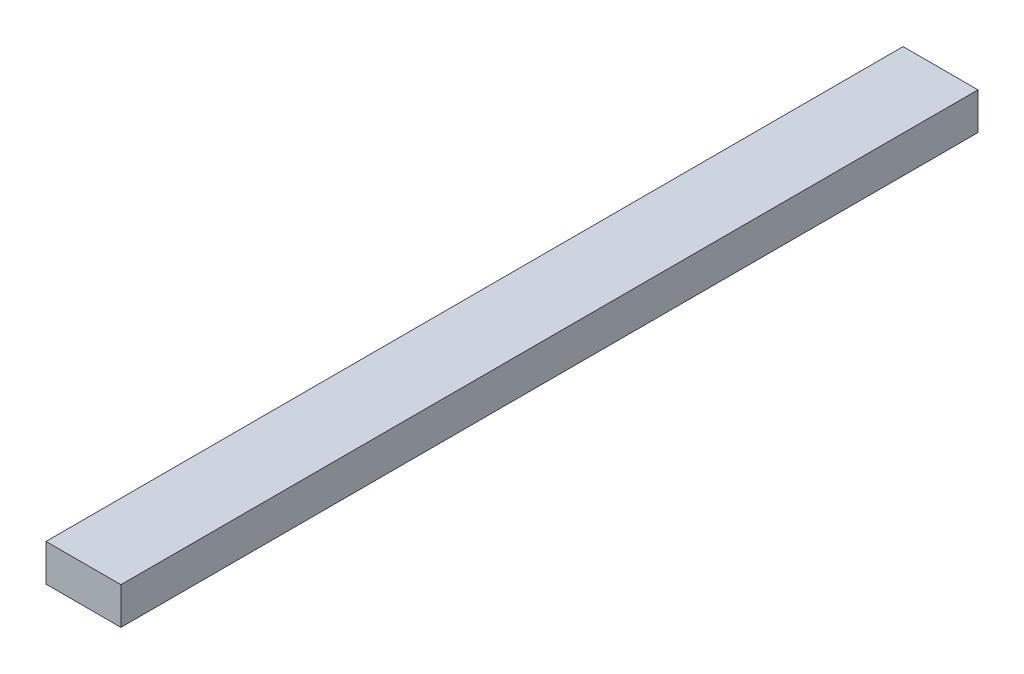
ISO-10303-21;
HEADER;
FILE_DESCRIPTION(('STEP AP214'),'2;1');
FILE_NAME('part.step','',(''),(''),'','','');
FILE_SCHEMA(('AUTOMOTIVE_DESIGN { 1 0 10303 214 1 1 1 1 }'));
ENDSEC;
DATA;
#1=APPLICATION_CONTEXT('core data for automotive mechanical design processes');
#2=APPLICATION_PROTOCOL_DEFINITION('international standard','automotive_design',2000,#1);
#3=PRODUCT_CONTEXT('',#1,'mechanical');
#4=PRODUCT('Part','Part','',(#3));
#5=PRODUCT_RELATED_PRODUCT_CATEGORY('part','',(#4));
#6=PRODUCT_DEFINITION_FORMATION('','',#4);
#7=PRODUCT_DEFINITION_CONTEXT('part definition',#1,'design');
#8=PRODUCT_DEFINITION('design','',#6,#7);
#9=PRODUCT_DEFINITION_SHAPE('','',#8);
#10=(LENGTH_UNIT() NAMED_UNIT(*) SI_UNIT(.MILLI.,.METRE.));
#11=(NAMED_UNIT(*) PLANE_ANGLE_UNIT() SI_UNIT($,.RADIAN.));
#12=(NAMED_UNIT(*) SI_UNIT($,.STERADIAN.) SOLID_ANGLE_UNIT());
#13=UNCERTAINTY_MEASURE_WITH_UNIT(LENGTH_MEASURE(1.E-05),#10,'distance_accuracy_value','');
#14=(GEOMETRIC_REPRESENTATION_CONTEXT(3) GLOBAL_UNCERTAINTY_ASSIGNED_CONTEXT((#13)) GLOBAL_UNIT_ASSIGNED_CONTEXT((#10,
#11,#12)) REPRESENTATION_CONTEXT('',''));
#15=CARTESIAN_POINT('',(0.,0.,0.));
#16=DIRECTION('',(0.,0.,1.));
#17=DIRECTION('',(1.,0.,0.));
#18=AXIS2_PLACEMENT_3D('',#15,#16,#17);
#19=CARTESIAN_POINT('',(6.075,-3.,139.));
#20=DIRECTION('',(-1.,0.,0.));
#21=DIRECTION('',(0.,0.,1.));
#22=AXIS2_PLACEMENT_3D('',#19,#20,#21);
#23=PLANE('',#22);
#24=DIRECTION('',(0.,1.,0.));
#25=VECTOR('',#24,1.);
#26=CARTESIAN_POINT('',(6.075,-3.,0.));
#27=LINE('',#26,#25);
#28=CARTESIAN_POINT('',(6.075,-3.,0.));
#29=VERTEX_POINT('',#28);
#30=CARTESIAN_POINT('',(6.075,3.,0.));
#31=VERTEX_POINT('',#30);
#32=EDGE_CURVE('E95',#29,#31,#27,.T.);
#33=ORIENTED_EDGE('',*,*,#32,.T.);
#34=DIRECTION('',(0.,0.,-1.));
#35=VECTOR('',#34,1.);
#36=CARTESIAN_POINT('',(6.075,3.,139.));
#37=LINE('',#36,#35);
#38=CARTESIAN_POINT('',(6.075,3.,139.));
#39=VERTEX_POINT('',#38);
#40=EDGE_CURVE('E11',#39,#31,#37,.T.);
#41=ORIENTED_EDGE('',*,*,#40,.F.);
#42=DIRECTION('',(0.,1.,0.));
#43=VECTOR('',#42,1.);
#44=CARTESIAN_POINT('',(6.075,-3.,139.));
#45=LINE('',#44,#43);
#46=CARTESIAN_POINT('',(6.075,-3.,139.));
#47=VERTEX_POINT('',#46);
#48=EDGE_CURVE('E83',#47,#39,#45,.T.);
#49=ORIENTED_EDGE('',*,*,#48,.F.);
#50=DIRECTION('',(0.,0.,-1.));
#51=VECTOR('',#50,1.);
#52=CARTESIAN_POINT('',(6.075,-3.,139.));
#53=LINE('',#52,#51);
#54=EDGE_CURVE('E91',#47,#29,#53,.T.);
#55=ORIENTED_EDGE('',*,*,#54,.T.);
#56=EDGE_LOOP('',(#33,#41,#49,#55));
#57=FACE_BOUND('',#56,.T.);
#58=ADVANCED_FACE('F32',(#57),#23,.F.);
#59=CARTESIAN_POINT('',(-6.075,3.,139.));
#60=DIRECTION('',(0.,-1.,0.));
#61=DIRECTION('',(0.,0.,-1.));
#62=AXIS2_PLACEMENT_3D('',#59,#60,#61);
#63=PLANE('',#62);
#64=DIRECTION('',(-1.,0.,0.));
#65=VECTOR('',#64,1.);
#66=CARTESIAN_POINT('',(-6.075,3.,0.));
#67=LINE('',#66,#65);
#68=CARTESIAN_POINT('',(-6.075,3.,0.));
#69=VERTEX_POINT('',#68);
#70=EDGE_CURVE('E87',#31,#69,#67,.T.);
#71=ORIENTED_EDGE('',*,*,#70,.T.);
#72=DIRECTION('',(0.,0.,-1.));
#73=VECTOR('',#72,1.);
#74=CARTESIAN_POINT('',(-6.075,3.,139.));
#75=LINE('',#74,#73);
#76=CARTESIAN_POINT('',(-6.075,3.,139.));
#77=VERTEX_POINT('',#76);
#78=EDGE_CURVE('E40',#77,#69,#75,.T.);
#79=ORIENTED_EDGE('',*,*,#78,.F.);
#80=DIRECTION('',(-1.,0.,0.));
#81=VECTOR('',#80,1.);
#82=CARTESIAN_POINT('',(-6.075,3.,139.));
#83=LINE('',#82,#81);
#84=EDGE_CURVE('E78',#39,#77,#83,.T.);
#85=ORIENTED_EDGE('',*,*,#84,.F.);
#86=ORIENTED_EDGE('',*,*,#40,.T.);
#87=EDGE_LOOP('',(#71,#79,#85,#86));
#88=FACE_BOUND('',#87,.T.);
#89=ADVANCED_FACE('F86',(#88),#63,.F.);
#90=CARTESIAN_POINT('',(-6.075,-3.,139.));
#91=DIRECTION('',(1.,0.,0.));
#92=DIRECTION('',(0.,0.,-1.));
#93=AXIS2_PLACEMENT_3D('',#90,#91,#92);
#94=PLANE('',#93);
#95=DIRECTION('',(0.,-1.,0.));
#96=VECTOR('',#95,1.);
#97=CARTESIAN_POINT('',(-6.075,-3.,0.));
#98=LINE('',#97,#96);
#99=CARTESIAN_POINT('',(-6.075,-3.,0.));
#100=VERTEX_POINT('',#99);
#101=EDGE_CURVE('E65',#69,#100,#98,.T.);
#102=ORIENTED_EDGE('',*,*,#101,.T.);
#103=DIRECTION('',(0.,0.,-1.));
#104=VECTOR('',#103,1.);
#105=CARTESIAN_POINT('',(-6.075,-3.,139.));
#106=LINE('',#105,#104);
#107=CARTESIAN_POINT('',(-6.075,-3.,139.));
#108=VERTEX_POINT('',#107);
#109=EDGE_CURVE('E88',#108,#100,#106,.T.);
#110=ORIENTED_EDGE('',*,*,#109,.F.);
#111=DIRECTION('',(0.,-1.,0.));
#112=VECTOR('',#111,1.);
#113=CARTESIAN_POINT('',(-6.075,-3.,139.));
#114=LINE('',#113,#112);
#115=EDGE_CURVE('E81',#77,#108,#114,.T.);
#116=ORIENTED_EDGE('',*,*,#115,.F.);
#117=ORIENTED_EDGE('',*,*,#78,.T.);
#118=EDGE_LOOP('',(#102,#110,#116,#117));
#119=FACE_BOUND('',#118,.T.);
#120=ADVANCED_FACE('F89',(#119),#94,.F.);
#121=CARTESIAN_POINT('',(-6.075,-3.,139.));
#122=DIRECTION('',(0.,1.,0.));
#123=DIRECTION('',(0.,0.,1.));
#124=AXIS2_PLACEMENT_3D('',#121,#122,#123);
#125=PLANE('',#124);
#126=DIRECTION('',(1.,0.,0.));
#127=VECTOR('',#126,1.);
#128=CARTESIAN_POINT('',(-6.075,-3.,0.));
#129=LINE('',#128,#127);
#130=EDGE_CURVE('E71',#100,#29,#129,.T.);
#131=ORIENTED_EDGE('',*,*,#130,.T.);
#132=ORIENTED_EDGE('',*,*,#54,.F.);
#133=DIRECTION('',(1.,0.,0.));
#134=VECTOR('',#133,1.);
#135=CARTESIAN_POINT('',(-6.075,-3.,139.));
#136=LINE('',#135,#134);
#137=EDGE_CURVE('E48',#108,#47,#136,.T.);
#138=ORIENTED_EDGE('',*,*,#137,.F.);
#139=ORIENTED_EDGE('',*,*,#109,.T.);
#140=EDGE_LOOP('',(#131,#132,#138,#139));
#141=FACE_BOUND('',#140,.T.);
#142=ADVANCED_FACE('F102',(#141),#125,.F.);
#143=CARTESIAN_POINT('',(0.,0.,139.));
#144=DIRECTION('',(0.,0.,-1.));
#145=DIRECTION('',(-1.,0.,0.));
#146=AXIS2_PLACEMENT_3D('',#143,#144,#145);
#147=PLANE('',#146);
#148=ORIENTED_EDGE('',*,*,#48,.T.);
#149=ORIENTED_EDGE('',*,*,#84,.T.);
#150=ORIENTED_EDGE('',*,*,#115,.T.);
#151=ORIENTED_EDGE('',*,*,#137,.T.);
#152=EDGE_LOOP('',(#148,#149,#150,#151));
#153=FACE_BOUND('',#152,.T.);
#154=ADVANCED_FACE('F79',(#153),#147,.F.);
#155=CARTESIAN_POINT('',(0.,0.,0.));
#156=DIRECTION('',(0.,0.,-1.));
#157=DIRECTION('',(-1.,0.,0.));
#158=AXIS2_PLACEMENT_3D('',#155,#156,#157);
#159=PLANE('',#158);
#160=ORIENTED_EDGE('',*,*,#32,.F.);
#161=ORIENTED_EDGE('',*,*,#130,.F.);
#162=ORIENTED_EDGE('',*,*,#101,.F.);
#163=ORIENTED_EDGE('',*,*,#70,.F.);
#164=EDGE_LOOP('',(#160,#161,#162,#163));
#165=FACE_BOUND('',#164,.T.);
#166=ADVANCED_FACE('F105',(#165),#159,.T.);
#167=CLOSED_SHELL('',(#58,#89,#120,#142,#154,#166));
#168=MANIFOLD_SOLID_BREP('B2',#167);
#169=ADVANCED_BREP_SHAPE_REPRESENTATION('',(#18,#168),#14);
#170=SHAPE_DEFINITION_REPRESENTATION(#9,#169);
ENDSEC;
END-ISO-10303-21;
